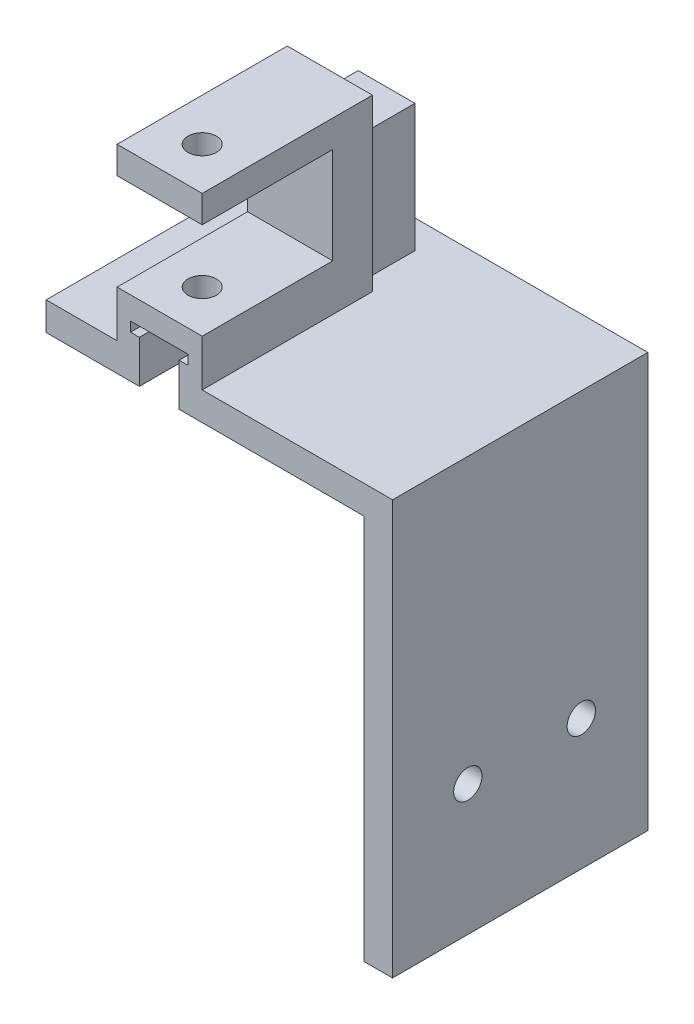
ISO-10303-21;
HEADER;
FILE_DESCRIPTION(('STEP AP214'),'2;1');
FILE_NAME('part.step','',(''),(''),'','','');
FILE_SCHEMA(('AUTOMOTIVE_DESIGN { 1 0 10303 214 1 1 1 1 }'));
ENDSEC;
DATA;
#1=APPLICATION_CONTEXT('core data for automotive mechanical design processes');
#2=APPLICATION_PROTOCOL_DEFINITION('international standard','automotive_design',2000,#1);
#3=PRODUCT_CONTEXT('',#1,'mechanical');
#4=PRODUCT('Part','Part','',(#3));
#5=PRODUCT_RELATED_PRODUCT_CATEGORY('part','',(#4));
#6=PRODUCT_DEFINITION_FORMATION('','',#4);
#7=PRODUCT_DEFINITION_CONTEXT('part definition',#1,'design');
#8=PRODUCT_DEFINITION('design','',#6,#7);
#9=PRODUCT_DEFINITION_SHAPE('','',#8);
#10=(LENGTH_UNIT() NAMED_UNIT(*) SI_UNIT(.MILLI.,.METRE.));
#11=(NAMED_UNIT(*) PLANE_ANGLE_UNIT() SI_UNIT($,.RADIAN.));
#12=(NAMED_UNIT(*) SI_UNIT($,.STERADIAN.) SOLID_ANGLE_UNIT());
#13=UNCERTAINTY_MEASURE_WITH_UNIT(LENGTH_MEASURE(1.E-05),#10,'distance_accuracy_value','');
#14=(GEOMETRIC_REPRESENTATION_CONTEXT(3) GLOBAL_UNCERTAINTY_ASSIGNED_CONTEXT((#13)) GLOBAL_UNIT_ASSIGNED_CONTEXT((#10,
#11,#12)) REPRESENTATION_CONTEXT('',''));
#15=CARTESIAN_POINT('',(0.,0.,0.));
#16=DIRECTION('',(0.,0.,1.));
#17=DIRECTION('',(1.,0.,0.));
#18=AXIS2_PLACEMENT_3D('',#15,#16,#17);
#19=CARTESIAN_POINT('',(0.,5.,0.));
#20=DIRECTION('',(0.,0.,-1.));
#21=DIRECTION('',(-1.,0.,0.));
#22=AXIS2_PLACEMENT_3D('',#19,#20,#21);
#23=PLANE('',#22);
#24=DIRECTION('',(1.,0.,0.));
#25=VECTOR('',#24,1.);
#26=CARTESIAN_POINT('',(23.4291720185786,7.5,0.));
#27=LINE('',#26,#25);
#28=CARTESIAN_POINT('',(23.4291720185786,7.5,0.));
#29=VERTEX_POINT('',#28);
#30=CARTESIAN_POINT('',(24.9791720185786,7.5,0.));
#31=VERTEX_POINT('',#30);
#32=EDGE_CURVE('E232',#29,#31,#27,.T.);
#33=ORIENTED_EDGE('',*,*,#32,.F.);
#34=DIRECTION('',(0.,1.,0.));
#35=VECTOR('',#34,1.);
#36=CARTESIAN_POINT('',(23.4291720185786,-2.94411630579094,0.));
#37=LINE('',#36,#35);
#38=CARTESIAN_POINT('',(23.4291720185786,0.,0.));
#39=VERTEX_POINT('',#38);
#40=EDGE_CURVE('E235',#39,#29,#37,.T.);
#41=ORIENTED_EDGE('',*,*,#40,.F.);
#42=DIRECTION('',(1.,0.,0.));
#43=VECTOR('',#42,1.);
#44=CARTESIAN_POINT('',(0.,0.,0.));
#45=LINE('',#44,#43);
#46=CARTESIAN_POINT('',(56.05,0.,0.));
#47=VERTEX_POINT('',#46);
#48=EDGE_CURVE('E56',#39,#47,#45,.T.);
#49=ORIENTED_EDGE('',*,*,#48,.T.);
#50=DIRECTION('',(0.,1.,0.));
#51=VECTOR('',#50,1.);
#52=CARTESIAN_POINT('',(56.05,-68.,0.));
#53=LINE('',#52,#51);
#54=CARTESIAN_POINT('',(56.05,-68.,0.));
#55=VERTEX_POINT('',#54);
#56=EDGE_CURVE('E296',#55,#47,#53,.T.);
#57=ORIENTED_EDGE('',*,*,#56,.F.);
#58=DIRECTION('',(-1.,0.,0.));
#59=VECTOR('',#58,1.);
#60=CARTESIAN_POINT('',(61.05,-68.,0.));
#61=LINE('',#60,#59);
#62=CARTESIAN_POINT('',(61.05,-68.,0.));
#63=VERTEX_POINT('',#62);
#64=EDGE_CURVE('E284',#63,#55,#61,.T.);
#65=ORIENTED_EDGE('',*,*,#64,.F.);
#66=DIRECTION('',(0.,-1.,0.));
#67=VECTOR('',#66,1.);
#68=CARTESIAN_POINT('',(61.05,5.,0.));
#69=LINE('',#68,#67);
#70=CARTESIAN_POINT('',(61.05,5.,0.));
#71=VERTEX_POINT('',#70);
#72=EDGE_CURVE('E421',#71,#63,#69,.T.);
#73=ORIENTED_EDGE('',*,*,#72,.F.);
#74=DIRECTION('',(1.,0.,0.));
#75=VECTOR('',#74,1.);
#76=CARTESIAN_POINT('',(0.,5.,0.));
#77=LINE('',#76,#75);
#78=CARTESIAN_POINT('',(27.5,5.,0.));
#79=VERTEX_POINT('',#78);
#80=EDGE_CURVE('E401',#79,#71,#77,.T.);
#81=ORIENTED_EDGE('',*,*,#80,.F.);
#82=DIRECTION('',(0.,-1.,0.));
#83=VECTOR('',#82,1.);
#84=CARTESIAN_POINT('',(27.5,35.,0.));
#85=LINE('',#84,#83);
#86=CARTESIAN_POINT('',(27.5,13.2,0.));
#87=VERTEX_POINT('',#86);
#88=EDGE_CURVE('E353',#87,#79,#85,.T.);
#89=ORIENTED_EDGE('',*,*,#88,.F.);
#90=DIRECTION('',(1.,0.,0.));
#91=VECTOR('',#90,1.);
#92=CARTESIAN_POINT('',(27.5,13.2,0.));
#93=LINE('',#92,#91);
#94=CARTESIAN_POINT('',(12.5,13.2,0.));
#95=VERTEX_POINT('',#94);
#96=EDGE_CURVE('E311',#95,#87,#93,.T.);
#97=ORIENTED_EDGE('',*,*,#96,.F.);
#98=DIRECTION('',(0.,-1.,0.));
#99=VECTOR('',#98,1.);
#100=CARTESIAN_POINT('',(12.5,35.,0.));
#101=LINE('',#100,#99);
#102=CARTESIAN_POINT('',(12.5,5.,0.));
#103=VERTEX_POINT('',#102);
#104=EDGE_CURVE('E357',#95,#103,#101,.T.);
#105=ORIENTED_EDGE('',*,*,#104,.T.);
#106=CARTESIAN_POINT('',(0.,5.,0.));
#107=VERTEX_POINT('',#106);
#108=EDGE_CURVE('E403',#107,#103,#77,.T.);
#109=ORIENTED_EDGE('',*,*,#108,.F.);
#110=DIRECTION('',(0.,-1.,0.));
#111=VECTOR('',#110,1.);
#112=CARTESIAN_POINT('',(0.,5.,0.));
#113=LINE('',#112,#111);
#114=CARTESIAN_POINT('',(0.,0.,0.));
#115=VERTEX_POINT('',#114);
#116=EDGE_CURVE('E423',#107,#115,#113,.T.);
#117=ORIENTED_EDGE('',*,*,#116,.T.);
#118=CARTESIAN_POINT('',(16.4291720185786,0.,0.));
#119=VERTEX_POINT('',#118);
#120=EDGE_CURVE('E413',#115,#119,#45,.T.);
#121=ORIENTED_EDGE('',*,*,#120,.T.);
#122=DIRECTION('',(0.,-1.,0.));
#123=VECTOR('',#122,1.);
#124=CARTESIAN_POINT('',(16.4291720185786,7.49999999999999,0.));
#125=LINE('',#124,#123);
#126=CARTESIAN_POINT('',(16.4291720185786,7.49999999999999,0.));
#127=VERTEX_POINT('',#126);
#128=EDGE_CURVE('E254',#127,#119,#125,.T.);
#129=ORIENTED_EDGE('',*,*,#128,.F.);
#130=DIRECTION('',(1.,0.,0.));
#131=VECTOR('',#130,1.);
#132=CARTESIAN_POINT('',(14.8791720185786,7.49999999999999,0.));
#133=LINE('',#132,#131);
#134=CARTESIAN_POINT('',(14.8791720185786,7.49999999999999,0.));
#135=VERTEX_POINT('',#134);
#136=EDGE_CURVE('E251',#135,#127,#133,.T.);
#137=ORIENTED_EDGE('',*,*,#136,.F.);
#138=DIRECTION('',(0.,-1.,0.));
#139=VECTOR('',#138,1.);
#140=CARTESIAN_POINT('',(14.8791720185786,9.19999999999999,0.));
#141=LINE('',#140,#139);
#142=CARTESIAN_POINT('',(14.8791720185786,9.19999999999999,0.));
#143=VERTEX_POINT('',#142);
#144=EDGE_CURVE('E248',#143,#135,#141,.T.);
#145=ORIENTED_EDGE('',*,*,#144,.F.);
#146=DIRECTION('',(-1.,0.,0.));
#147=VECTOR('',#146,1.);
#148=CARTESIAN_POINT('',(24.9791720185786,9.2,0.));
#149=LINE('',#148,#147);
#150=CARTESIAN_POINT('',(24.9791720185786,9.2,0.));
#151=VERTEX_POINT('',#150);
#152=EDGE_CURVE('E246',#151,#143,#149,.T.);
#153=ORIENTED_EDGE('',*,*,#152,.F.);
#154=DIRECTION('',(0.,1.,0.));
#155=VECTOR('',#154,1.);
#156=CARTESIAN_POINT('',(24.9791720185786,7.5,0.));
#157=LINE('',#156,#155);
#158=EDGE_CURVE('E215',#31,#151,#157,.T.);
#159=ORIENTED_EDGE('',*,*,#158,.F.);
#160=EDGE_LOOP('',(#33,#41,#49,#57,#65,#73,#81,#89,#97,#105,#109,#117,#121,#129,#137,#145,#153,#159));
#161=FACE_BOUND('',#160,.T.);
#162=ADVANCED_FACE('F33',(#161),#23,.F.);
#163=CARTESIAN_POINT('',(0.,5.,0.));
#164=DIRECTION('',(0.,-1.,0.));
#165=DIRECTION('',(0.,0.,-1.));
#166=AXIS2_PLACEMENT_3D('',#163,#164,#165);
#167=PLANE('',#166);
#168=DIRECTION('',(0.,0.,-1.));
#169=VECTOR('',#168,1.);
#170=CARTESIAN_POINT('',(27.5,5.,-30.));
#171=LINE('',#170,#169);
#172=CARTESIAN_POINT('',(27.5,5.,-30.));
#173=VERTEX_POINT('',#172);
#174=EDGE_CURVE('E344',#79,#173,#171,.T.);
#175=ORIENTED_EDGE('',*,*,#174,.F.);
#176=ORIENTED_EDGE('',*,*,#80,.T.);
#177=DIRECTION('',(0.,0.,-1.));
#178=VECTOR('',#177,1.);
#179=CARTESIAN_POINT('',(61.05,5.,0.));
#180=LINE('',#179,#178);
#181=CARTESIAN_POINT('',(61.05,5.,-45.));
#182=VERTEX_POINT('',#181);
#183=EDGE_CURVE('E406',#71,#182,#180,.T.);
#184=ORIENTED_EDGE('',*,*,#183,.T.);
#185=DIRECTION('',(-1.,0.,0.));
#186=VECTOR('',#185,1.);
#187=CARTESIAN_POINT('',(0.,5.,-45.));
#188=LINE('',#187,#186);
#189=CARTESIAN_POINT('',(0.,5.,-45.));
#190=VERTEX_POINT('',#189);
#191=EDGE_CURVE('E408',#182,#190,#188,.T.);
#192=ORIENTED_EDGE('',*,*,#191,.T.);
#193=DIRECTION('',(0.,0.,1.));
#194=VECTOR('',#193,1.);
#195=CARTESIAN_POINT('',(0.,5.,0.));
#196=LINE('',#195,#194);
#197=EDGE_CURVE('E398',#190,#107,#196,.T.);
#198=ORIENTED_EDGE('',*,*,#197,.T.);
#199=ORIENTED_EDGE('',*,*,#108,.T.);
#200=DIRECTION('',(0.,0.,1.));
#201=VECTOR('',#200,1.);
#202=CARTESIAN_POINT('',(12.5,5.,-30.));
#203=LINE('',#202,#201);
#204=CARTESIAN_POINT('',(12.5,5.,-30.));
#205=VERTEX_POINT('',#204);
#206=EDGE_CURVE('E324',#205,#103,#203,.T.);
#207=ORIENTED_EDGE('',*,*,#206,.F.);
#208=DIRECTION('',(-1.,0.,0.));
#209=VECTOR('',#208,1.);
#210=CARTESIAN_POINT('',(12.5,5.,-30.));
#211=LINE('',#210,#209);
#212=CARTESIAN_POINT('',(15.,5.,-30.));
#213=VERTEX_POINT('',#212);
#214=EDGE_CURVE('E346',#213,#205,#211,.T.);
#215=ORIENTED_EDGE('',*,*,#214,.F.);
#216=DIRECTION('',(0.,0.,1.));
#217=VECTOR('',#216,1.);
#218=CARTESIAN_POINT('',(15.,5.,-40.));
#219=LINE('',#218,#217);
#220=CARTESIAN_POINT('',(15.,5.,-40.));
#221=VERTEX_POINT('',#220);
#222=EDGE_CURVE('E365',#221,#213,#219,.T.);
#223=ORIENTED_EDGE('',*,*,#222,.F.);
#224=DIRECTION('',(-1.,0.,0.));
#225=VECTOR('',#224,1.);
#226=CARTESIAN_POINT('',(15.,5.,-40.));
#227=LINE('',#226,#225);
#228=CARTESIAN_POINT('',(25.,5.,-40.));
#229=VERTEX_POINT('',#228);
#230=EDGE_CURVE('E372',#229,#221,#227,.T.);
#231=ORIENTED_EDGE('',*,*,#230,.F.);
#232=DIRECTION('',(0.,0.,-1.));
#233=VECTOR('',#232,1.);
#234=CARTESIAN_POINT('',(25.,5.,-40.));
#235=LINE('',#234,#233);
#236=CARTESIAN_POINT('',(25.,5.,-30.));
#237=VERTEX_POINT('',#236);
#238=EDGE_CURVE('E382',#237,#229,#235,.T.);
#239=ORIENTED_EDGE('',*,*,#238,.F.);
#240=EDGE_CURVE('E335',#173,#237,#211,.T.);
#241=ORIENTED_EDGE('',*,*,#240,.F.);
#242=EDGE_LOOP('',(#175,#176,#184,#192,#198,#199,#207,#215,#223,#231,#239,#241));
#243=FACE_BOUND('',#242,.T.);
#244=ADVANCED_FACE('F478',(#243),#167,.F.);
#245=CARTESIAN_POINT('',(0.,5.,0.));
#246=DIRECTION('',(1.,0.,0.));
#247=DIRECTION('',(0.,0.,-1.));
#248=AXIS2_PLACEMENT_3D('',#245,#246,#247);
#249=PLANE('',#248);
#250=DIRECTION('',(0.,0.,1.));
#251=VECTOR('',#250,1.);
#252=CARTESIAN_POINT('',(0.,0.,0.));
#253=LINE('',#252,#251);
#254=CARTESIAN_POINT('',(0.,0.,-45.));
#255=VERTEX_POINT('',#254);
#256=EDGE_CURVE('E397',#255,#115,#253,.T.);
#257=ORIENTED_EDGE('',*,*,#256,.T.);
#258=ORIENTED_EDGE('',*,*,#116,.F.);
#259=ORIENTED_EDGE('',*,*,#197,.F.);
#260=DIRECTION('',(0.,-1.,0.));
#261=VECTOR('',#260,1.);
#262=CARTESIAN_POINT('',(0.,5.,-45.));
#263=LINE('',#262,#261);
#264=EDGE_CURVE('E410',#190,#255,#263,.T.);
#265=ORIENTED_EDGE('',*,*,#264,.T.);
#266=EDGE_LOOP('',(#257,#258,#259,#265));
#267=FACE_BOUND('',#266,.T.);
#268=ADVANCED_FACE('F35',(#267),#249,.F.);
#269=CARTESIAN_POINT('',(12.5,35.,0.));
#270=VERTEX_POINT('',#269);
#271=CARTESIAN_POINT('',(12.5,30.2,0.));
#272=VERTEX_POINT('',#271);
#273=EDGE_CURVE('E358',#270,#272,#101,.T.);
#274=ORIENTED_EDGE('',*,*,#273,.T.);
#275=DIRECTION('',(-1.,0.,0.));
#276=VECTOR('',#275,1.);
#277=CARTESIAN_POINT('',(27.5,30.2,0.));
#278=LINE('',#277,#276);
#279=CARTESIAN_POINT('',(27.5,30.2,0.));
#280=VERTEX_POINT('',#279);
#281=EDGE_CURVE('E306',#280,#272,#278,.T.);
#282=ORIENTED_EDGE('',*,*,#281,.F.);
#283=CARTESIAN_POINT('',(27.5,35.,0.));
#284=VERTEX_POINT('',#283);
#285=EDGE_CURVE('E354',#284,#280,#85,.T.);
#286=ORIENTED_EDGE('',*,*,#285,.F.);
#287=DIRECTION('',(1.,0.,0.));
#288=VECTOR('',#287,1.);
#289=CARTESIAN_POINT('',(12.5,35.,0.));
#290=LINE('',#289,#288);
#291=EDGE_CURVE('E334',#270,#284,#290,.T.);
#292=ORIENTED_EDGE('',*,*,#291,.F.);
#293=EDGE_LOOP('',(#274,#282,#286,#292));
#294=FACE_BOUND('',#293,.T.);
#295=ADVANCED_FACE('F529',(#294),#23,.F.);
#296=CARTESIAN_POINT('',(61.05,5.,0.));
#297=DIRECTION('',(-1.,0.,0.));
#298=DIRECTION('',(0.,0.,1.));
#299=AXIS2_PLACEMENT_3D('',#296,#297,#298);
#300=PLANE('',#299);
#301=CARTESIAN_POINT('',(61.05,-45.,-33.2741894380194));
#302=DIRECTION('',(1.,0.,0.));
#303=DIRECTION('',(0.,0.,-1.));
#304=AXIS2_PLACEMENT_3D('',#301,#302,#303);
#305=CIRCLE('',#304,2.5);
#306=CARTESIAN_POINT('',(61.05,-45.,-35.7741894380194));
#307=VERTEX_POINT('',#306);
#308=EDGE_CURVE('E268',#307,#307,#305,.T.);
#309=ORIENTED_EDGE('',*,*,#308,.F.);
#310=EDGE_LOOP('',(#309));
#311=FACE_BOUND('',#310,.T.);
#312=CARTESIAN_POINT('',(61.05,-45.,-13.2741894380194));
#313=DIRECTION('',(1.,0.,0.));
#314=DIRECTION('',(0.,0.,-1.));
#315=AXIS2_PLACEMENT_3D('',#312,#313,#314);
#316=CIRCLE('',#315,2.5);
#317=CARTESIAN_POINT('',(61.05,-45.,-15.7741894380194));
#318=VERTEX_POINT('',#317);
#319=EDGE_CURVE('E274',#318,#318,#316,.T.);
#320=ORIENTED_EDGE('',*,*,#319,.F.);
#321=EDGE_LOOP('',(#320));
#322=FACE_BOUND('',#321,.T.);
#323=ORIENTED_EDGE('',*,*,#72,.T.);
#324=DIRECTION('',(0.,0.,1.));
#325=VECTOR('',#324,1.);
#326=CARTESIAN_POINT('',(61.05,-68.,0.));
#327=LINE('',#326,#325);
#328=CARTESIAN_POINT('',(61.05,-68.,-45.));
#329=VERTEX_POINT('',#328);
#330=EDGE_CURVE('E281',#329,#63,#327,.T.);
#331=ORIENTED_EDGE('',*,*,#330,.F.);
#332=DIRECTION('',(0.,-1.,0.));
#333=VECTOR('',#332,1.);
#334=CARTESIAN_POINT('',(61.05,5.,-45.));
#335=LINE('',#334,#333);
#336=EDGE_CURVE('E419',#182,#329,#335,.T.);
#337=ORIENTED_EDGE('',*,*,#336,.F.);
#338=ORIENTED_EDGE('',*,*,#183,.F.);
#339=EDGE_LOOP('',(#323,#331,#337,#338));
#340=FACE_BOUND('',#339,.T.);
#341=ADVANCED_FACE('F475',(#311,#322,#340),#300,.F.);
#342=CARTESIAN_POINT('',(0.,5.,-45.));
#343=DIRECTION('',(0.,0.,1.));
#344=DIRECTION('',(1.,0.,0.));
#345=AXIS2_PLACEMENT_3D('',#342,#343,#344);
#346=PLANE('',#345);
#347=ORIENTED_EDGE('',*,*,#336,.T.);
#348=DIRECTION('',(1.,0.,0.));
#349=VECTOR('',#348,1.);
#350=CARTESIAN_POINT('',(61.05,-68.,-45.));
#351=LINE('',#350,#349);
#352=CARTESIAN_POINT('',(56.05,-68.,-45.));
#353=VERTEX_POINT('',#352);
#354=EDGE_CURVE('E288',#353,#329,#351,.T.);
#355=ORIENTED_EDGE('',*,*,#354,.F.);
#356=DIRECTION('',(0.,1.,0.));
#357=VECTOR('',#356,1.);
#358=CARTESIAN_POINT('',(56.05,-68.,-45.));
#359=LINE('',#358,#357);
#360=CARTESIAN_POINT('',(56.05,0.,-45.));
#361=VERTEX_POINT('',#360);
#362=EDGE_CURVE('E291',#353,#361,#359,.T.);
#363=ORIENTED_EDGE('',*,*,#362,.T.);
#364=DIRECTION('',(-1.,0.,0.));
#365=VECTOR('',#364,1.);
#366=CARTESIAN_POINT('',(0.,0.,-45.));
#367=LINE('',#366,#365);
#368=EDGE_CURVE('E402',#361,#255,#367,.T.);
#369=ORIENTED_EDGE('',*,*,#368,.T.);
#370=ORIENTED_EDGE('',*,*,#264,.F.);
#371=ORIENTED_EDGE('',*,*,#191,.F.);
#372=EDGE_LOOP('',(#347,#355,#363,#369,#370,#371));
#373=FACE_BOUND('',#372,.T.);
#374=ADVANCED_FACE('F460',(#373),#346,.F.);
#375=CARTESIAN_POINT('',(0.,0.,0.));
#376=DIRECTION('',(0.,-1.,0.));
#377=DIRECTION('',(0.,0.,-1.));
#378=AXIS2_PLACEMENT_3D('',#375,#376,#377);
#379=PLANE('',#378);
#380=DIRECTION('',(0.,0.,1.));
#381=VECTOR('',#380,1.);
#382=CARTESIAN_POINT('',(23.4291720185786,0.,0.));
#383=LINE('',#382,#381);
#384=CARTESIAN_POINT('',(23.4291720185786,0.,-16.));
#385=VERTEX_POINT('',#384);
#386=EDGE_CURVE('E11',#385,#39,#383,.T.);
#387=ORIENTED_EDGE('',*,*,#386,.F.);
#388=DIRECTION('',(-1.,0.,0.));
#389=VECTOR('',#388,1.);
#390=CARTESIAN_POINT('',(0.,0.,-16.));
#391=LINE('',#390,#389);
#392=CARTESIAN_POINT('',(16.4291720185786,0.,-16.));
#393=VERTEX_POINT('',#392);
#394=EDGE_CURVE('E426',#385,#393,#391,.T.);
#395=ORIENTED_EDGE('',*,*,#394,.T.);
#396=DIRECTION('',(0.,0.,-1.));
#397=VECTOR('',#396,1.);
#398=CARTESIAN_POINT('',(16.4291720185786,0.,0.));
#399=LINE('',#398,#397);
#400=EDGE_CURVE('E41',#119,#393,#399,.T.);
#401=ORIENTED_EDGE('',*,*,#400,.F.);
#402=ORIENTED_EDGE('',*,*,#120,.F.);
#403=ORIENTED_EDGE('',*,*,#256,.F.);
#404=ORIENTED_EDGE('',*,*,#368,.F.);
#405=DIRECTION('',(0.,0.,-1.));
#406=VECTOR('',#405,1.);
#407=CARTESIAN_POINT('',(56.05,0.,0.));
#408=LINE('',#407,#406);
#409=EDGE_CURVE('E280',#47,#361,#408,.T.);
#410=ORIENTED_EDGE('',*,*,#409,.F.);
#411=ORIENTED_EDGE('',*,*,#48,.F.);
#412=EDGE_LOOP('',(#387,#395,#401,#402,#403,#404,#410,#411));
#413=FACE_BOUND('',#412,.T.);
#414=ADVANCED_FACE('F438',(#413),#379,.T.);
#415=CARTESIAN_POINT('',(15.,27.5,-40.));
#416=DIRECTION('',(1.,0.,0.));
#417=DIRECTION('',(0.,0.,-1.));
#418=AXIS2_PLACEMENT_3D('',#415,#416,#417);
#419=PLANE('',#418);
#420=ORIENTED_EDGE('',*,*,#222,.T.);
#421=DIRECTION('',(0.,-1.,0.));
#422=VECTOR('',#421,1.);
#423=CARTESIAN_POINT('',(15.,27.5,-30.));
#424=LINE('',#423,#422);
#425=CARTESIAN_POINT('',(15.,27.5,-30.));
#426=VERTEX_POINT('',#425);
#427=EDGE_CURVE('E395',#426,#213,#424,.T.);
#428=ORIENTED_EDGE('',*,*,#427,.F.);
#429=DIRECTION('',(0.,0.,1.));
#430=VECTOR('',#429,1.);
#431=CARTESIAN_POINT('',(15.,27.5,-40.));
#432=LINE('',#431,#430);
#433=CARTESIAN_POINT('',(15.,27.5,-40.));
#434=VERTEX_POINT('',#433);
#435=EDGE_CURVE('E368',#434,#426,#432,.T.);
#436=ORIENTED_EDGE('',*,*,#435,.F.);
#437=DIRECTION('',(0.,-1.,0.));
#438=VECTOR('',#437,1.);
#439=CARTESIAN_POINT('',(15.,27.5,-40.));
#440=LINE('',#439,#438);
#441=EDGE_CURVE('E379',#434,#221,#440,.T.);
#442=ORIENTED_EDGE('',*,*,#441,.T.);
#443=EDGE_LOOP('',(#420,#428,#436,#442));
#444=FACE_BOUND('',#443,.T.);
#445=ADVANCED_FACE('F502',(#444),#419,.F.);
#446=CARTESIAN_POINT('',(25.,27.5,-40.));
#447=DIRECTION('',(-1.,0.,0.));
#448=DIRECTION('',(0.,0.,1.));
#449=AXIS2_PLACEMENT_3D('',#446,#447,#448);
#450=PLANE('',#449);
#451=ORIENTED_EDGE('',*,*,#238,.T.);
#452=DIRECTION('',(0.,-1.,0.));
#453=VECTOR('',#452,1.);
#454=CARTESIAN_POINT('',(25.,27.5,-40.));
#455=LINE('',#454,#453);
#456=CARTESIAN_POINT('',(25.,27.5,-40.));
#457=VERTEX_POINT('',#456);
#458=EDGE_CURVE('E389',#457,#229,#455,.T.);
#459=ORIENTED_EDGE('',*,*,#458,.F.);
#460=DIRECTION('',(0.,0.,-1.));
#461=VECTOR('',#460,1.);
#462=CARTESIAN_POINT('',(25.,27.5,-40.));
#463=LINE('',#462,#461);
#464=CARTESIAN_POINT('',(25.,27.5,-30.));
#465=VERTEX_POINT('',#464);
#466=EDGE_CURVE('E375',#465,#457,#463,.T.);
#467=ORIENTED_EDGE('',*,*,#466,.F.);
#468=DIRECTION('',(0.,-1.,0.));
#469=VECTOR('',#468,1.);
#470=CARTESIAN_POINT('',(25.,27.5,-30.));
#471=LINE('',#470,#469);
#472=EDGE_CURVE('E392',#465,#237,#471,.T.);
#473=ORIENTED_EDGE('',*,*,#472,.T.);
#474=EDGE_LOOP('',(#451,#459,#467,#473));
#475=FACE_BOUND('',#474,.T.);
#476=ADVANCED_FACE('F511',(#475),#450,.F.);
#477=CARTESIAN_POINT('',(15.,27.5,-40.));
#478=DIRECTION('',(0.,0.,1.));
#479=DIRECTION('',(1.,0.,0.));
#480=AXIS2_PLACEMENT_3D('',#477,#478,#479);
#481=PLANE('',#480);
#482=CARTESIAN_POINT('',(20.,20.9,-40.));
#483=DIRECTION('',(0.,0.,-1.));
#484=DIRECTION('',(-1.,0.,0.));
#485=AXIS2_PLACEMENT_3D('',#482,#483,#484);
#486=CIRCLE('',#485,4.);
#487=CARTESIAN_POINT('',(16.,20.9,-40.));
#488=VERTEX_POINT('',#487);
#489=EDGE_CURVE('E361',#488,#488,#486,.T.);
#490=ORIENTED_EDGE('',*,*,#489,.F.);
#491=EDGE_LOOP('',(#490));
#492=FACE_BOUND('',#491,.T.);
#493=ORIENTED_EDGE('',*,*,#230,.T.);
#494=ORIENTED_EDGE('',*,*,#441,.F.);
#495=DIRECTION('',(-1.,0.,0.));
#496=VECTOR('',#495,1.);
#497=CARTESIAN_POINT('',(15.,27.5,-40.));
#498=LINE('',#497,#496);
#499=EDGE_CURVE('E377',#457,#434,#498,.T.);
#500=ORIENTED_EDGE('',*,*,#499,.F.);
#501=ORIENTED_EDGE('',*,*,#458,.T.);
#502=EDGE_LOOP('',(#493,#494,#500,#501));
#503=FACE_BOUND('',#502,.T.);
#504=ADVANCED_FACE('F507',(#492,#503),#481,.F.);
#505=CARTESIAN_POINT('',(0.,27.5,0.));
#506=DIRECTION('',(0.,1.,0.));
#507=DIRECTION('',(0.,0.,1.));
#508=AXIS2_PLACEMENT_3D('',#505,#506,#507);
#509=PLANE('',#508);
#510=ORIENTED_EDGE('',*,*,#435,.T.);
#511=DIRECTION('',(1.,0.,0.));
#512=VECTOR('',#511,1.);
#513=CARTESIAN_POINT('',(15.,27.5,-30.));
#514=LINE('',#513,#512);
#515=EDGE_CURVE('E371',#426,#465,#514,.T.);
#516=ORIENTED_EDGE('',*,*,#515,.T.);
#517=ORIENTED_EDGE('',*,*,#466,.T.);
#518=ORIENTED_EDGE('',*,*,#499,.T.);
#519=EDGE_LOOP('',(#510,#516,#517,#518));
#520=FACE_BOUND('',#519,.T.);
#521=ADVANCED_FACE('F515',(#520),#509,.T.);
#522=CARTESIAN_POINT('',(20.,20.9,-32.));
#523=DIRECTION('',(0.,0.,-1.));
#524=DIRECTION('',(-1.,0.,0.));
#525=AXIS2_PLACEMENT_3D('',#522,#523,#524);
#526=CYLINDRICAL_SURFACE('',#525,4.);
#527=CARTESIAN_POINT('',(20.,20.9,-32.));
#528=DIRECTION('',(0.,0.,-1.));
#529=DIRECTION('',(-1.,0.,0.));
#530=AXIS2_PLACEMENT_3D('',#527,#528,#529);
#531=CIRCLE('',#530,4.);
#532=CARTESIAN_POINT('',(16.,20.9,-32.));
#533=VERTEX_POINT('',#532);
#534=EDGE_CURVE('E362',#533,#533,#531,.T.);
#535=ORIENTED_EDGE('',*,*,#534,.F.);
#536=EDGE_LOOP('',(#535));
#537=FACE_BOUND('',#536,.T.);
#538=ORIENTED_EDGE('',*,*,#489,.T.);
#539=EDGE_LOOP('',(#538));
#540=FACE_BOUND('',#539,.T.);
#541=ADVANCED_FACE('F517',(#537,#540),#526,.F.);
#542=CARTESIAN_POINT('',(20.,20.9,-32.));
#543=DIRECTION('',(0.,0.,-1.));
#544=DIRECTION('',(-1.,0.,0.));
#545=AXIS2_PLACEMENT_3D('',#542,#543,#544);
#546=PLANE('',#545);
#547=ORIENTED_EDGE('',*,*,#534,.T.);
#548=EDGE_LOOP('',(#547));
#549=FACE_BOUND('',#548,.T.);
#550=ADVANCED_FACE('F523',(#549),#546,.T.);
#551=CARTESIAN_POINT('',(12.5,35.,-30.));
#552=DIRECTION('',(0.,0.,1.));
#553=DIRECTION('',(1.,0.,0.));
#554=AXIS2_PLACEMENT_3D('',#551,#552,#553);
#555=PLANE('',#554);
#556=ORIENTED_EDGE('',*,*,#515,.F.);
#557=ORIENTED_EDGE('',*,*,#427,.T.);
#558=ORIENTED_EDGE('',*,*,#214,.T.);
#559=DIRECTION('',(0.,-1.,0.));
#560=VECTOR('',#559,1.);
#561=CARTESIAN_POINT('',(12.5,35.,-30.));
#562=LINE('',#561,#560);
#563=CARTESIAN_POINT('',(12.5,35.,-30.));
#564=VERTEX_POINT('',#563);
#565=EDGE_CURVE('E341',#564,#205,#562,.T.);
#566=ORIENTED_EDGE('',*,*,#565,.F.);
#567=DIRECTION('',(-1.,0.,0.));
#568=VECTOR('',#567,1.);
#569=CARTESIAN_POINT('',(12.5,35.,-30.));
#570=LINE('',#569,#568);
#571=CARTESIAN_POINT('',(27.5,35.,-30.));
#572=VERTEX_POINT('',#571);
#573=EDGE_CURVE('E339',#572,#564,#570,.T.);
#574=ORIENTED_EDGE('',*,*,#573,.F.);
#575=DIRECTION('',(0.,-1.,0.));
#576=VECTOR('',#575,1.);
#577=CARTESIAN_POINT('',(27.5,35.,-30.));
#578=LINE('',#577,#576);
#579=EDGE_CURVE('E350',#572,#173,#578,.T.);
#580=ORIENTED_EDGE('',*,*,#579,.T.);
#581=ORIENTED_EDGE('',*,*,#240,.T.);
#582=ORIENTED_EDGE('',*,*,#472,.F.);
#583=EDGE_LOOP('',(#556,#557,#558,#566,#574,#580,#581,#582));
#584=FACE_BOUND('',#583,.T.);
#585=ADVANCED_FACE('F513',(#584),#555,.F.);
#586=CARTESIAN_POINT('',(12.5,35.,-30.));
#587=DIRECTION('',(1.,0.,0.));
#588=DIRECTION('',(0.,0.,-1.));
#589=AXIS2_PLACEMENT_3D('',#586,#587,#588);
#590=PLANE('',#589);
#591=ORIENTED_EDGE('',*,*,#104,.F.);
#592=DIRECTION('',(0.,0.,1.));
#593=VECTOR('',#592,1.);
#594=CARTESIAN_POINT('',(12.5,13.2,-23.));
#595=LINE('',#594,#593);
#596=CARTESIAN_POINT('',(12.5,13.2,-23.));
#597=VERTEX_POINT('',#596);
#598=EDGE_CURVE('E325',#597,#95,#595,.T.);
#599=ORIENTED_EDGE('',*,*,#598,.F.);
#600=DIRECTION('',(0.,-1.,0.));
#601=VECTOR('',#600,1.);
#602=CARTESIAN_POINT('',(12.5,30.2,-23.));
#603=LINE('',#602,#601);
#604=CARTESIAN_POINT('',(12.5,30.2,-23.));
#605=VERTEX_POINT('',#604);
#606=EDGE_CURVE('E314',#605,#597,#603,.T.);
#607=ORIENTED_EDGE('',*,*,#606,.F.);
#608=DIRECTION('',(0.,0.,1.));
#609=VECTOR('',#608,1.);
#610=CARTESIAN_POINT('',(12.5,30.2,-23.));
#611=LINE('',#610,#609);
#612=EDGE_CURVE('E327',#605,#272,#611,.T.);
#613=ORIENTED_EDGE('',*,*,#612,.T.);
#614=ORIENTED_EDGE('',*,*,#273,.F.);
#615=DIRECTION('',(0.,0.,1.));
#616=VECTOR('',#615,1.);
#617=CARTESIAN_POINT('',(12.5,35.,-30.));
#618=LINE('',#617,#616);
#619=EDGE_CURVE('E331',#564,#270,#618,.T.);
#620=ORIENTED_EDGE('',*,*,#619,.F.);
#621=ORIENTED_EDGE('',*,*,#565,.T.);
#622=ORIENTED_EDGE('',*,*,#206,.T.);
#623=EDGE_LOOP('',(#591,#599,#607,#613,#614,#620,#621,#622));
#624=FACE_BOUND('',#623,.T.);
#625=ADVANCED_FACE('F495',(#624),#590,.F.);
#626=CARTESIAN_POINT('',(27.5,35.,-30.));
#627=DIRECTION('',(-1.,0.,0.));
#628=DIRECTION('',(0.,0.,1.));
#629=AXIS2_PLACEMENT_3D('',#626,#627,#628);
#630=PLANE('',#629);
#631=DIRECTION('',(0.,1.,0.));
#632=VECTOR('',#631,1.);
#633=CARTESIAN_POINT('',(27.5,30.2,-23.));
#634=LINE('',#633,#632);
#635=CARTESIAN_POINT('',(27.5,13.2,-23.));
#636=VERTEX_POINT('',#635);
#637=CARTESIAN_POINT('',(27.5,30.2,-23.));
#638=VERTEX_POINT('',#637);
#639=EDGE_CURVE('E307',#636,#638,#634,.T.);
#640=ORIENTED_EDGE('',*,*,#639,.F.);
#641=DIRECTION('',(0.,0.,1.));
#642=VECTOR('',#641,1.);
#643=CARTESIAN_POINT('',(27.5,13.2,-23.));
#644=LINE('',#643,#642);
#645=EDGE_CURVE('E321',#636,#87,#644,.T.);
#646=ORIENTED_EDGE('',*,*,#645,.T.);
#647=ORIENTED_EDGE('',*,*,#88,.T.);
#648=ORIENTED_EDGE('',*,*,#174,.T.);
#649=ORIENTED_EDGE('',*,*,#579,.F.);
#650=DIRECTION('',(0.,0.,-1.));
#651=VECTOR('',#650,1.);
#652=CARTESIAN_POINT('',(27.5,35.,-30.));
#653=LINE('',#652,#651);
#654=EDGE_CURVE('E337',#284,#572,#653,.T.);
#655=ORIENTED_EDGE('',*,*,#654,.F.);
#656=ORIENTED_EDGE('',*,*,#285,.T.);
#657=DIRECTION('',(0.,0.,1.));
#658=VECTOR('',#657,1.);
#659=CARTESIAN_POINT('',(27.5,30.2,-23.));
#660=LINE('',#659,#658);
#661=EDGE_CURVE('E318',#638,#280,#660,.T.);
#662=ORIENTED_EDGE('',*,*,#661,.F.);
#663=EDGE_LOOP('',(#640,#646,#647,#648,#649,#655,#656,#662));
#664=FACE_BOUND('',#663,.T.);
#665=ADVANCED_FACE('F485',(#664),#630,.F.);
#666=CARTESIAN_POINT('',(0.,35.,0.));
#667=DIRECTION('',(0.,1.,0.));
#668=DIRECTION('',(0.,0.,1.));
#669=AXIS2_PLACEMENT_3D('',#666,#667,#668);
#670=PLANE('',#669);
#671=CARTESIAN_POINT('',(20.,35.,-7.5));
#672=DIRECTION('',(0.,1.,0.));
#673=DIRECTION('',(0.,0.,1.));
#674=AXIS2_PLACEMENT_3D('',#671,#672,#673);
#675=CIRCLE('',#674,2.49999999999999);
#676=CARTESIAN_POINT('',(20.,35.,-5.));
#677=VERTEX_POINT('',#676);
#678=EDGE_CURVE('E299',#677,#677,#675,.T.);
#679=ORIENTED_EDGE('',*,*,#678,.F.);
#680=EDGE_LOOP('',(#679));
#681=FACE_BOUND('',#680,.T.);
#682=ORIENTED_EDGE('',*,*,#619,.T.);
#683=ORIENTED_EDGE('',*,*,#291,.T.);
#684=ORIENTED_EDGE('',*,*,#654,.T.);
#685=ORIENTED_EDGE('',*,*,#573,.T.);
#686=EDGE_LOOP('',(#682,#683,#684,#685));
#687=FACE_BOUND('',#686,.T.);
#688=ADVANCED_FACE('F553',(#681,#687),#670,.T.);
#689=CARTESIAN_POINT('',(27.5,13.2,-23.));
#690=DIRECTION('',(0.,-1.,0.));
#691=DIRECTION('',(1.,0.,0.));
#692=AXIS2_PLACEMENT_3D('',#689,#690,#691);
#693=PLANE('',#692);
#694=CARTESIAN_POINT('',(20.,13.2,-7.5));
#695=DIRECTION('',(0.,-1.,0.));
#696=DIRECTION('',(1.,0.,0.));
#697=AXIS2_PLACEMENT_3D('',#694,#695,#696);
#698=CIRCLE('',#697,2.49999999999999);
#699=CARTESIAN_POINT('',(22.5,13.2,-7.5));
#700=VERTEX_POINT('',#699);
#701=EDGE_CURVE('E303',#700,#700,#698,.T.);
#702=ORIENTED_EDGE('',*,*,#701,.T.);
#703=EDGE_LOOP('',(#702));
#704=FACE_BOUND('',#703,.T.);
#705=ORIENTED_EDGE('',*,*,#96,.T.);
#706=ORIENTED_EDGE('',*,*,#645,.F.);
#707=DIRECTION('',(1.,0.,0.));
#708=VECTOR('',#707,1.);
#709=CARTESIAN_POINT('',(27.5,13.2,-23.));
#710=LINE('',#709,#708);
#711=EDGE_CURVE('E316',#597,#636,#710,.T.);
#712=ORIENTED_EDGE('',*,*,#711,.F.);
#713=ORIENTED_EDGE('',*,*,#598,.T.);
#714=EDGE_LOOP('',(#705,#706,#712,#713));
#715=FACE_BOUND('',#714,.T.);
#716=ADVANCED_FACE('F491',(#704,#715),#693,.F.);
#717=CARTESIAN_POINT('',(27.5,30.2,-23.));
#718=DIRECTION('',(0.,1.,0.));
#719=DIRECTION('',(-1.,0.,0.));
#720=AXIS2_PLACEMENT_3D('',#717,#718,#719);
#721=PLANE('',#720);
#722=CARTESIAN_POINT('',(20.,30.2,-7.5));
#723=DIRECTION('',(0.,1.,0.));
#724=DIRECTION('',(-1.,0.,0.));
#725=AXIS2_PLACEMENT_3D('',#722,#723,#724);
#726=CIRCLE('',#725,2.49999999999999);
#727=CARTESIAN_POINT('',(17.5,30.2,-7.5));
#728=VERTEX_POINT('',#727);
#729=EDGE_CURVE('E302',#728,#728,#726,.T.);
#730=ORIENTED_EDGE('',*,*,#729,.T.);
#731=EDGE_LOOP('',(#730));
#732=FACE_BOUND('',#731,.T.);
#733=ORIENTED_EDGE('',*,*,#281,.T.);
#734=ORIENTED_EDGE('',*,*,#612,.F.);
#735=DIRECTION('',(-1.,0.,0.));
#736=VECTOR('',#735,1.);
#737=CARTESIAN_POINT('',(27.5,30.2,-23.));
#738=LINE('',#737,#736);
#739=EDGE_CURVE('E310',#638,#605,#738,.T.);
#740=ORIENTED_EDGE('',*,*,#739,.F.);
#741=ORIENTED_EDGE('',*,*,#661,.T.);
#742=EDGE_LOOP('',(#733,#734,#740,#741));
#743=FACE_BOUND('',#742,.T.);
#744=ADVANCED_FACE('F547',(#732,#743),#721,.F.);
#745=CARTESIAN_POINT('',(0.,0.,-23.));
#746=DIRECTION('',(0.,0.,-1.));
#747=DIRECTION('',(-1.,0.,0.));
#748=AXIS2_PLACEMENT_3D('',#745,#746,#747);
#749=PLANE('',#748);
#750=ORIENTED_EDGE('',*,*,#639,.T.);
#751=ORIENTED_EDGE('',*,*,#739,.T.);
#752=ORIENTED_EDGE('',*,*,#606,.T.);
#753=ORIENTED_EDGE('',*,*,#711,.T.);
#754=EDGE_LOOP('',(#750,#751,#752,#753));
#755=FACE_BOUND('',#754,.T.);
#756=ADVANCED_FACE('F549',(#755),#749,.F.);
#757=CARTESIAN_POINT('',(20.,0.,-7.5));
#758=DIRECTION('',(0.,1.,0.));
#759=DIRECTION('',(0.,0.,1.));
#760=AXIS2_PLACEMENT_3D('',#757,#758,#759);
#761=CYLINDRICAL_SURFACE('',#760,2.49999999999999);
#762=ORIENTED_EDGE('',*,*,#678,.T.);
#763=EDGE_LOOP('',(#762));
#764=FACE_BOUND('',#763,.T.);
#765=ORIENTED_EDGE('',*,*,#729,.F.);
#766=EDGE_LOOP('',(#765));
#767=FACE_BOUND('',#766,.T.);
#768=ADVANCED_FACE('F602',(#764,#767),#761,.F.);
#769=CARTESIAN_POINT('',(20.,9.2,-7.5));
#770=DIRECTION('',(0.,1.,0.));
#771=DIRECTION('',(-1.,0.,0.));
#772=AXIS2_PLACEMENT_3D('',#769,#770,#771);
#773=CIRCLE('',#772,2.49999999999999);
#774=CARTESIAN_POINT('',(17.5,9.2,-7.5));
#775=VERTEX_POINT('',#774);
#776=EDGE_CURVE('E259',#775,#775,#773,.F.);
#777=ORIENTED_EDGE('',*,*,#776,.T.);
#778=EDGE_LOOP('',(#777));
#779=FACE_BOUND('',#778,.T.);
#780=ORIENTED_EDGE('',*,*,#701,.F.);
#781=EDGE_LOOP('',(#780));
#782=FACE_BOUND('',#781,.T.);
#783=ADVANCED_FACE('F631',(#779,#782),#761,.F.);
#784=CARTESIAN_POINT('',(56.05,-68.,0.));
#785=DIRECTION('',(1.,0.,0.));
#786=DIRECTION('',(0.,0.,-1.));
#787=AXIS2_PLACEMENT_3D('',#784,#785,#786);
#788=PLANE('',#787);
#789=CARTESIAN_POINT('',(56.05,-45.,-33.2741894380194));
#790=DIRECTION('',(1.,0.,0.));
#791=DIRECTION('',(0.,0.,-1.));
#792=AXIS2_PLACEMENT_3D('',#789,#790,#791);
#793=CIRCLE('',#792,2.5);
#794=CARTESIAN_POINT('',(56.05,-45.,-35.7741894380194));
#795=VERTEX_POINT('',#794);
#796=EDGE_CURVE('E271',#795,#795,#793,.F.);
#797=ORIENTED_EDGE('',*,*,#796,.F.);
#798=EDGE_LOOP('',(#797));
#799=FACE_BOUND('',#798,.T.);
#800=CARTESIAN_POINT('',(56.05,-45.,-13.2741894380194));
#801=DIRECTION('',(1.,0.,0.));
#802=DIRECTION('',(0.,0.,-1.));
#803=AXIS2_PLACEMENT_3D('',#800,#801,#802);
#804=CIRCLE('',#803,2.5);
#805=CARTESIAN_POINT('',(56.05,-45.,-15.7741894380194));
#806=VERTEX_POINT('',#805);
#807=EDGE_CURVE('E277',#806,#806,#804,.F.);
#808=ORIENTED_EDGE('',*,*,#807,.F.);
#809=EDGE_LOOP('',(#808));
#810=FACE_BOUND('',#809,.T.);
#811=ORIENTED_EDGE('',*,*,#409,.T.);
#812=ORIENTED_EDGE('',*,*,#362,.F.);
#813=DIRECTION('',(0.,0.,-1.));
#814=VECTOR('',#813,1.);
#815=CARTESIAN_POINT('',(56.05,-68.,0.));
#816=LINE('',#815,#814);
#817=EDGE_CURVE('E286',#55,#353,#816,.T.);
#818=ORIENTED_EDGE('',*,*,#817,.F.);
#819=ORIENTED_EDGE('',*,*,#56,.T.);
#820=EDGE_LOOP('',(#811,#812,#818,#819));
#821=FACE_BOUND('',#820,.T.);
#822=ADVANCED_FACE('F465',(#799,#810,#821),#788,.F.);
#823=CARTESIAN_POINT('',(0.,-68.,0.));
#824=DIRECTION('',(0.,1.,0.));
#825=DIRECTION('',(0.,0.,1.));
#826=AXIS2_PLACEMENT_3D('',#823,#824,#825);
#827=PLANE('',#826);
#828=ORIENTED_EDGE('',*,*,#330,.T.);
#829=ORIENTED_EDGE('',*,*,#64,.T.);
#830=ORIENTED_EDGE('',*,*,#817,.T.);
#831=ORIENTED_EDGE('',*,*,#354,.T.);
#832=EDGE_LOOP('',(#828,#829,#830,#831));
#833=FACE_BOUND('',#832,.T.);
#834=ADVANCED_FACE('F472',(#833),#827,.F.);
#835=CARTESIAN_POINT('',(48.9789321881345,-45.,-13.2741894380194));
#836=DIRECTION('',(1.,0.,0.));
#837=DIRECTION('',(0.,0.,-1.));
#838=AXIS2_PLACEMENT_3D('',#835,#836,#837);
#839=CYLINDRICAL_SURFACE('',#838,2.5);
#840=ORIENTED_EDGE('',*,*,#807,.T.);
#841=EDGE_LOOP('',(#840));
#842=FACE_BOUND('',#841,.T.);
#843=ORIENTED_EDGE('',*,*,#319,.T.);
#844=EDGE_LOOP('',(#843));
#845=FACE_BOUND('',#844,.T.);
#846=ADVANCED_FACE('F655',(#842,#845),#839,.F.);
#847=CARTESIAN_POINT('',(48.9789321881345,-45.,-33.2741894380194));
#848=DIRECTION('',(1.,0.,0.));
#849=DIRECTION('',(0.,0.,-1.));
#850=AXIS2_PLACEMENT_3D('',#847,#848,#849);
#851=CYLINDRICAL_SURFACE('',#850,2.5);
#852=ORIENTED_EDGE('',*,*,#796,.T.);
#853=EDGE_LOOP('',(#852));
#854=FACE_BOUND('',#853,.T.);
#855=ORIENTED_EDGE('',*,*,#308,.T.);
#856=EDGE_LOOP('',(#855));
#857=FACE_BOUND('',#856,.T.);
#858=ADVANCED_FACE('F679',(#854,#857),#851,.F.);
#859=CARTESIAN_POINT('',(24.9791720185786,9.2,-16.));
#860=DIRECTION('',(0.,1.,0.));
#861=DIRECTION('',(-1.,0.,0.));
#862=AXIS2_PLACEMENT_3D('',#859,#860,#861);
#863=PLANE('',#862);
#864=ORIENTED_EDGE('',*,*,#152,.T.);
#865=DIRECTION('',(0.,0.,1.));
#866=VECTOR('',#865,1.);
#867=CARTESIAN_POINT('',(14.8791720185786,9.19999999999999,-16.));
#868=LINE('',#867,#866);
#869=CARTESIAN_POINT('',(14.8791720185786,9.19999999999999,-16.));
#870=VERTEX_POINT('',#869);
#871=EDGE_CURVE('E219',#870,#143,#868,.T.);
#872=ORIENTED_EDGE('',*,*,#871,.F.);
#873=DIRECTION('',(-1.,0.,0.));
#874=VECTOR('',#873,1.);
#875=CARTESIAN_POINT('',(24.9791720185786,9.2,-16.));
#876=LINE('',#875,#874);
#877=CARTESIAN_POINT('',(24.9791720185786,9.2,-16.));
#878=VERTEX_POINT('',#877);
#879=EDGE_CURVE('E223',#878,#870,#876,.T.);
#880=ORIENTED_EDGE('',*,*,#879,.F.);
#881=DIRECTION('',(0.,0.,1.));
#882=VECTOR('',#881,1.);
#883=CARTESIAN_POINT('',(24.9791720185786,9.2,-16.));
#884=LINE('',#883,#882);
#885=EDGE_CURVE('E208',#878,#151,#884,.T.);
#886=ORIENTED_EDGE('',*,*,#885,.T.);
#887=EDGE_LOOP('',(#864,#872,#880,#886));
#888=FACE_BOUND('',#887,.T.);
#889=ORIENTED_EDGE('',*,*,#776,.F.);
#890=EDGE_LOOP('',(#889));
#891=FACE_BOUND('',#890,.T.);
#892=ADVANCED_FACE('F224',(#888,#891),#863,.F.);
#893=CARTESIAN_POINT('',(24.9791720185786,7.5,-16.));
#894=DIRECTION('',(1.,0.,0.));
#895=DIRECTION('',(0.,0.,-1.));
#896=AXIS2_PLACEMENT_3D('',#893,#894,#895);
#897=PLANE('',#896);
#898=ORIENTED_EDGE('',*,*,#158,.T.);
#899=ORIENTED_EDGE('',*,*,#885,.F.);
#900=DIRECTION('',(0.,1.,0.));
#901=VECTOR('',#900,1.);
#902=CARTESIAN_POINT('',(24.9791720185786,7.5,-16.));
#903=LINE('',#902,#901);
#904=CARTESIAN_POINT('',(24.9791720185786,7.5,-16.));
#905=VERTEX_POINT('',#904);
#906=EDGE_CURVE('E212',#905,#878,#903,.T.);
#907=ORIENTED_EDGE('',*,*,#906,.F.);
#908=DIRECTION('',(0.,0.,1.));
#909=VECTOR('',#908,1.);
#910=CARTESIAN_POINT('',(24.9791720185786,7.5,-16.));
#911=LINE('',#910,#909);
#912=EDGE_CURVE('E257',#905,#31,#911,.T.);
#913=ORIENTED_EDGE('',*,*,#912,.T.);
#914=EDGE_LOOP('',(#898,#899,#907,#913));
#915=FACE_BOUND('',#914,.T.);
#916=ADVANCED_FACE('F210',(#915),#897,.F.);
#917=CARTESIAN_POINT('',(23.4291720185786,7.5,-16.));
#918=DIRECTION('',(0.,-1.,0.));
#919=DIRECTION('',(1.,0.,0.));
#920=AXIS2_PLACEMENT_3D('',#917,#918,#919);
#921=PLANE('',#920);
#922=ORIENTED_EDGE('',*,*,#32,.T.);
#923=ORIENTED_EDGE('',*,*,#912,.F.);
#924=DIRECTION('',(1.,0.,0.));
#925=VECTOR('',#924,1.);
#926=CARTESIAN_POINT('',(23.4291720185786,7.5,-16.));
#927=LINE('',#926,#925);
#928=CARTESIAN_POINT('',(23.4291720185786,7.5,-16.));
#929=VERTEX_POINT('',#928);
#930=EDGE_CURVE('E220',#929,#905,#927,.T.);
#931=ORIENTED_EDGE('',*,*,#930,.F.);
#932=DIRECTION('',(0.,0.,1.));
#933=VECTOR('',#932,1.);
#934=CARTESIAN_POINT('',(23.4291720185786,7.5,-16.));
#935=LINE('',#934,#933);
#936=EDGE_CURVE('E260',#929,#29,#935,.T.);
#937=ORIENTED_EDGE('',*,*,#936,.T.);
#938=EDGE_LOOP('',(#922,#923,#931,#937));
#939=FACE_BOUND('',#938,.T.);
#940=ADVANCED_FACE('F445',(#939),#921,.F.);
#941=CARTESIAN_POINT('',(23.4291720185786,-2.94411630579094,-16.));
#942=DIRECTION('',(1.,0.,0.));
#943=DIRECTION('',(0.,0.,-1.));
#944=AXIS2_PLACEMENT_3D('',#941,#942,#943);
#945=PLANE('',#944);
#946=ORIENTED_EDGE('',*,*,#386,.T.);
#947=ORIENTED_EDGE('',*,*,#40,.T.);
#948=ORIENTED_EDGE('',*,*,#936,.F.);
#949=DIRECTION('',(0.,1.,0.));
#950=VECTOR('',#949,1.);
#951=CARTESIAN_POINT('',(23.4291720185786,-2.94411630579094,-16.));
#952=LINE('',#951,#950);
#953=EDGE_CURVE('E242',#385,#929,#952,.T.);
#954=ORIENTED_EDGE('',*,*,#953,.F.);
#955=EDGE_LOOP('',(#946,#947,#948,#954));
#956=FACE_BOUND('',#955,.T.);
#957=ADVANCED_FACE('F442',(#956),#945,.F.);
#958=CARTESIAN_POINT('',(16.4291720185786,7.49999999999999,-16.));
#959=DIRECTION('',(-1.,0.,0.));
#960=DIRECTION('',(0.,-1.,0.));
#961=AXIS2_PLACEMENT_3D('',#958,#959,#960);
#962=PLANE('',#961);
#963=ORIENTED_EDGE('',*,*,#400,.T.);
#964=DIRECTION('',(0.,-1.,0.));
#965=VECTOR('',#964,1.);
#966=CARTESIAN_POINT('',(16.4291720185786,7.49999999999999,-16.));
#967=LINE('',#966,#965);
#968=CARTESIAN_POINT('',(16.4291720185786,7.49999999999999,-16.));
#969=VERTEX_POINT('',#968);
#970=EDGE_CURVE('E48',#969,#393,#967,.T.);
#971=ORIENTED_EDGE('',*,*,#970,.F.);
#972=DIRECTION('',(0.,0.,1.));
#973=VECTOR('',#972,1.);
#974=CARTESIAN_POINT('',(16.4291720185786,7.49999999999999,-16.));
#975=LINE('',#974,#973);
#976=EDGE_CURVE('E263',#969,#127,#975,.T.);
#977=ORIENTED_EDGE('',*,*,#976,.T.);
#978=ORIENTED_EDGE('',*,*,#128,.T.);
#979=EDGE_LOOP('',(#963,#971,#977,#978));
#980=FACE_BOUND('',#979,.T.);
#981=ADVANCED_FACE('F434',(#980),#962,.F.);
#982=CARTESIAN_POINT('',(14.8791720185786,7.49999999999999,-16.));
#983=DIRECTION('',(0.,-1.,0.));
#984=DIRECTION('',(0.,0.,-1.));
#985=AXIS2_PLACEMENT_3D('',#982,#983,#984);
#986=PLANE('',#985);
#987=ORIENTED_EDGE('',*,*,#136,.T.);
#988=ORIENTED_EDGE('',*,*,#976,.F.);
#989=DIRECTION('',(1.,0.,0.));
#990=VECTOR('',#989,1.);
#991=CARTESIAN_POINT('',(14.8791720185786,7.49999999999999,-16.));
#992=LINE('',#991,#990);
#993=CARTESIAN_POINT('',(14.8791720185786,7.49999999999999,-16.));
#994=VERTEX_POINT('',#993);
#995=EDGE_CURVE('E239',#994,#969,#992,.T.);
#996=ORIENTED_EDGE('',*,*,#995,.F.);
#997=DIRECTION('',(0.,0.,1.));
#998=VECTOR('',#997,1.);
#999=CARTESIAN_POINT('',(14.8791720185786,7.49999999999999,-16.));
#1000=LINE('',#999,#998);
#1001=EDGE_CURVE('E265',#994,#135,#1000,.T.);
#1002=ORIENTED_EDGE('',*,*,#1001,.T.);
#1003=EDGE_LOOP('',(#987,#988,#996,#1002));
#1004=FACE_BOUND('',#1003,.T.);
#1005=ADVANCED_FACE('F452',(#1004),#986,.F.);
#1006=CARTESIAN_POINT('',(14.8791720185786,9.19999999999999,-16.));
#1007=DIRECTION('',(-1.,0.,0.));
#1008=DIRECTION('',(0.,-1.,0.));
#1009=AXIS2_PLACEMENT_3D('',#1006,#1007,#1008);
#1010=PLANE('',#1009);
#1011=ORIENTED_EDGE('',*,*,#144,.T.);
#1012=ORIENTED_EDGE('',*,*,#1001,.F.);
#1013=DIRECTION('',(0.,-1.,0.));
#1014=VECTOR('',#1013,1.);
#1015=CARTESIAN_POINT('',(14.8791720185786,9.19999999999999,-16.));
#1016=LINE('',#1015,#1014);
#1017=EDGE_CURVE('E228',#870,#994,#1016,.T.);
#1018=ORIENTED_EDGE('',*,*,#1017,.F.);
#1019=ORIENTED_EDGE('',*,*,#871,.T.);
#1020=EDGE_LOOP('',(#1011,#1012,#1018,#1019));
#1021=FACE_BOUND('',#1020,.T.);
#1022=ADVANCED_FACE('F449',(#1021),#1010,.F.);
#1023=CARTESIAN_POINT('',(0.,0.,-16.));
#1024=DIRECTION('',(0.,0.,1.));
#1025=DIRECTION('',(1.,0.,0.));
#1026=AXIS2_PLACEMENT_3D('',#1023,#1024,#1025);
#1027=PLANE('',#1026);
#1028=ORIENTED_EDGE('',*,*,#953,.T.);
#1029=ORIENTED_EDGE('',*,*,#930,.T.);
#1030=ORIENTED_EDGE('',*,*,#906,.T.);
#1031=ORIENTED_EDGE('',*,*,#879,.T.);
#1032=ORIENTED_EDGE('',*,*,#1017,.T.);
#1033=ORIENTED_EDGE('',*,*,#995,.T.);
#1034=ORIENTED_EDGE('',*,*,#970,.T.);
#1035=ORIENTED_EDGE('',*,*,#394,.F.);
#1036=EDGE_LOOP('',(#1028,#1029,#1030,#1031,#1032,#1033,#1034,#1035));
#1037=FACE_BOUND('',#1036,.T.);
#1038=ADVANCED_FACE('F230',(#1037),#1027,.T.);
#1039=CLOSED_SHELL('',(#162,#244,#268,#295,#341,#374,#414,#445,#476,#504,#521,#541,#550,#585,
#625,#665,#688,#716,#744,#756,#768,#783,#822,#834,#846,#858,#892,#916,#940,#957,#981,#1005,
#1022,#1038));
#1040=MANIFOLD_SOLID_BREP('B2',#1039);
#1041=ADVANCED_BREP_SHAPE_REPRESENTATION('',(#18,#1040),#14);
#1042=SHAPE_DEFINITION_REPRESENTATION(#9,#1041);
ENDSEC;
END-ISO-10303-21;
